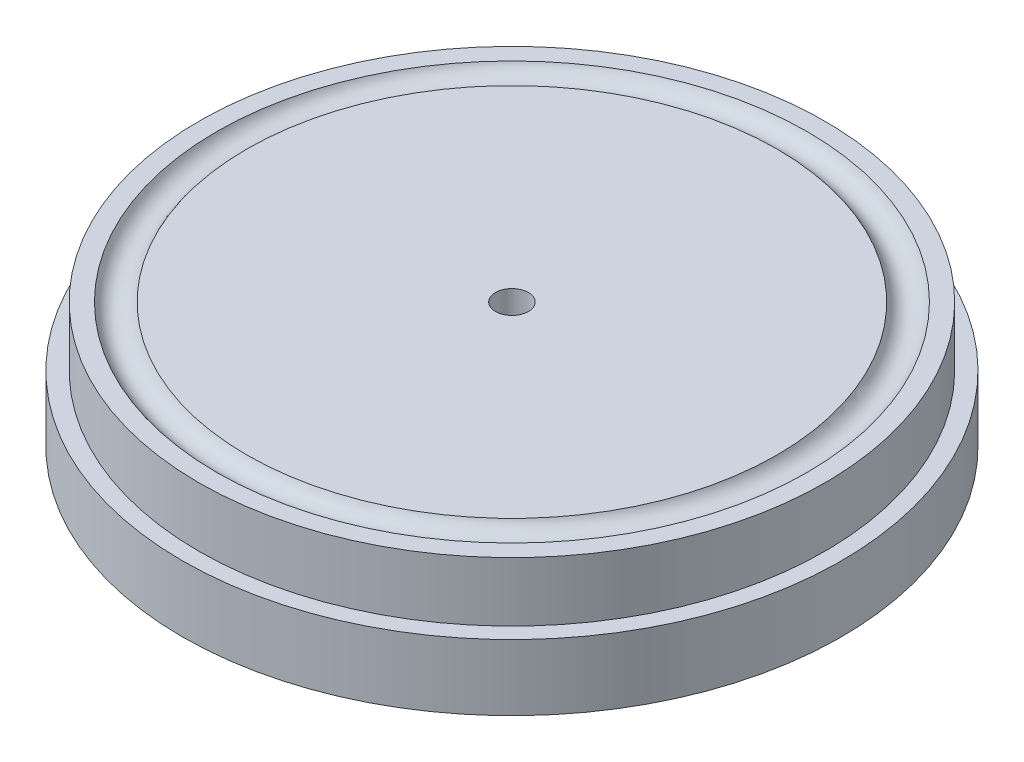
ISO-10303-21;
HEADER;
FILE_DESCRIPTION(('STEP AP214'),'2;1');
FILE_NAME('part.step','',(''),(''),'','','');
FILE_SCHEMA(('AUTOMOTIVE_DESIGN { 1 0 10303 214 1 1 1 1 }'));
ENDSEC;
DATA;
#1=APPLICATION_CONTEXT('core data for automotive mechanical design processes');
#2=APPLICATION_PROTOCOL_DEFINITION('international standard','automotive_design',2000,#1);
#3=PRODUCT_CONTEXT('',#1,'mechanical');
#4=PRODUCT('Part','Part','',(#3));
#5=PRODUCT_RELATED_PRODUCT_CATEGORY('part','',(#4));
#6=PRODUCT_DEFINITION_FORMATION('','',#4);
#7=PRODUCT_DEFINITION_CONTEXT('part definition',#1,'design');
#8=PRODUCT_DEFINITION('design','',#6,#7);
#9=PRODUCT_DEFINITION_SHAPE('','',#8);
#10=(LENGTH_UNIT() NAMED_UNIT(*) SI_UNIT(.MILLI.,.METRE.));
#11=(NAMED_UNIT(*) PLANE_ANGLE_UNIT() SI_UNIT($,.RADIAN.));
#12=(NAMED_UNIT(*) SI_UNIT($,.STERADIAN.) SOLID_ANGLE_UNIT());
#13=UNCERTAINTY_MEASURE_WITH_UNIT(LENGTH_MEASURE(1.E-05),#10,'distance_accuracy_value','');
#14=(GEOMETRIC_REPRESENTATION_CONTEXT(3) GLOBAL_UNCERTAINTY_ASSIGNED_CONTEXT((#13)) GLOBAL_UNIT_ASSIGNED_CONTEXT((#10,
#11,#12)) REPRESENTATION_CONTEXT('',''));
#15=CARTESIAN_POINT('',(0.,0.,0.));
#16=DIRECTION('',(0.,0.,1.));
#17=DIRECTION('',(1.,0.,0.));
#18=AXIS2_PLACEMENT_3D('',#15,#16,#17);
#19=CARTESIAN_POINT('',(0.,20.,0.));
#20=DIRECTION('',(0.,-1.,0.));
#21=DIRECTION('',(0.,0.,-1.));
#22=AXIS2_PLACEMENT_3D('',#19,#20,#21);
#23=CYLINDRICAL_SURFACE('',#22,47.5);
#24=CARTESIAN_POINT('',(0.,10.,0.));
#25=DIRECTION('',(0.,1.,0.));
#26=DIRECTION('',(0.,0.,1.));
#27=AXIS2_PLACEMENT_3D('',#24,#25,#26);
#28=CIRCLE('',#27,47.5);
#29=CARTESIAN_POINT('',(0.,10.,47.5));
#30=VERTEX_POINT('',#29);
#31=EDGE_CURVE('E11',#30,#30,#28,.T.);
#32=ORIENTED_EDGE('',*,*,#31,.T.);
#33=EDGE_LOOP('',(#32));
#34=FACE_BOUND('',#33,.T.);
#35=CARTESIAN_POINT('',(0.,19.,0.));
#36=DIRECTION('',(0.,1.,0.));
#37=DIRECTION('',(0.,0.,1.));
#38=AXIS2_PLACEMENT_3D('',#35,#36,#37);
#39=CIRCLE('',#38,47.5);
#40=CARTESIAN_POINT('',(0.,19.,47.5));
#41=VERTEX_POINT('',#40);
#42=EDGE_CURVE('E72',#41,#41,#39,.T.);
#43=ORIENTED_EDGE('',*,*,#42,.F.);
#44=EDGE_LOOP('',(#43));
#45=FACE_BOUND('',#44,.T.);
#46=ADVANCED_FACE('F43',(#34,#45),#23,.T.);
#47=CARTESIAN_POINT('',(0.,10.,0.));
#48=DIRECTION('',(0.,-1.,0.));
#49=DIRECTION('',(0.,0.,-1.));
#50=AXIS2_PLACEMENT_3D('',#47,#48,#49);
#51=CYLINDRICAL_SURFACE('',#50,50.);
#52=CARTESIAN_POINT('',(0.,10.,0.));
#53=DIRECTION('',(0.,1.,0.));
#54=DIRECTION('',(0.,0.,1.));
#55=AXIS2_PLACEMENT_3D('',#52,#53,#54);
#56=CIRCLE('',#55,50.);
#57=CARTESIAN_POINT('',(0.,10.,50.));
#58=VERTEX_POINT('',#57);
#59=EDGE_CURVE('E52',#58,#58,#56,.T.);
#60=ORIENTED_EDGE('',*,*,#59,.F.);
#61=EDGE_LOOP('',(#60));
#62=FACE_BOUND('',#61,.T.);
#63=CARTESIAN_POINT('',(0.,0.,0.));
#64=DIRECTION('',(0.,1.,0.));
#65=DIRECTION('',(0.,0.,1.));
#66=AXIS2_PLACEMENT_3D('',#63,#64,#65);
#67=CIRCLE('',#66,50.);
#68=CARTESIAN_POINT('',(0.,0.,50.));
#69=VERTEX_POINT('',#68);
#70=EDGE_CURVE('E78',#69,#69,#67,.T.);
#71=ORIENTED_EDGE('',*,*,#70,.T.);
#72=EDGE_LOOP('',(#71));
#73=FACE_BOUND('',#72,.T.);
#74=ADVANCED_FACE('F45',(#62,#73),#51,.T.);
#75=CARTESIAN_POINT('',(0.,10.,0.));
#76=DIRECTION('',(0.,1.,0.));
#77=DIRECTION('',(0.,0.,1.));
#78=AXIS2_PLACEMENT_3D('',#75,#76,#77);
#79=PLANE('',#78);
#80=ORIENTED_EDGE('',*,*,#31,.F.);
#81=EDGE_LOOP('',(#80));
#82=FACE_BOUND('',#81,.T.);
#83=ORIENTED_EDGE('',*,*,#59,.T.);
#84=EDGE_LOOP('',(#83));
#85=FACE_BOUND('',#84,.T.);
#86=ADVANCED_FACE('F88',(#82,#85),#79,.T.);
#87=CARTESIAN_POINT('',(0.,0.,0.));
#88=DIRECTION('',(0.,1.,0.));
#89=DIRECTION('',(0.,0.,1.));
#90=AXIS2_PLACEMENT_3D('',#87,#88,#89);
#91=PLANE('',#90);
#92=ORIENTED_EDGE('',*,*,#70,.F.);
#93=EDGE_LOOP('',(#92));
#94=FACE_BOUND('',#93,.T.);
#95=ADVANCED_FACE('F85',(#94),#91,.F.);
#96=CARTESIAN_POINT('',(0.,19.,0.));
#97=DIRECTION('',(0.,1.,0.));
#98=DIRECTION('',(0.,0.,1.));
#99=AXIS2_PLACEMENT_3D('',#96,#97,#98);
#100=PLANE('',#99);
#101=CARTESIAN_POINT('',(0.,19.,0.));
#102=DIRECTION('',(0.,1.,0.));
#103=DIRECTION('',(0.,0.,1.));
#104=AXIS2_PLACEMENT_3D('',#101,#102,#103);
#105=CIRCLE('',#104,44.7912878474779);
#106=CARTESIAN_POINT('',(44.7912878474779,19.,0.));
#107=VERTEX_POINT('',#106);
#108=EDGE_CURVE('E58',#107,#107,#105,.T.);
#109=ORIENTED_EDGE('',*,*,#108,.F.);
#110=EDGE_LOOP('',(#109));
#111=FACE_BOUND('',#110,.T.);
#112=ORIENTED_EDGE('',*,*,#42,.T.);
#113=EDGE_LOOP('',(#112));
#114=FACE_BOUND('',#113,.T.);
#115=ADVANCED_FACE('F87',(#111,#114),#100,.T.);
#116=CARTESIAN_POINT('',(0.,20.,0.));
#117=DIRECTION('',(0.,1.,0.));
#118=DIRECTION('',(0.,0.,1.));
#119=AXIS2_PLACEMENT_3D('',#116,#117,#118);
#120=TOROIDAL_SURFACE('',#119,42.5,2.5);
#121=CARTESIAN_POINT('',(42.5,20.,0.));
#122=DIRECTION('',(0.,0.,1.));
#123=DIRECTION('',(1.,0.,0.));
#124=AXIS2_PLACEMENT_3D('',#121,#122,#123);
#125=CIRCLE('',#124,2.5);
#126=CARTESIAN_POINT('',(40.2087121525221,19.,0.));
#127=VERTEX_POINT('',#126);
#128=EDGE_CURVE('E77',#127,#107,#125,.T.);
#129=ORIENTED_EDGE('',*,*,#128,.T.);
#130=ORIENTED_EDGE('',*,*,#108,.T.);
#131=ORIENTED_EDGE('',*,*,#128,.F.);
#132=CARTESIAN_POINT('',(0.,19.,0.));
#133=DIRECTION('',(0.,-1.,0.));
#134=DIRECTION('',(0.,0.,-1.));
#135=AXIS2_PLACEMENT_3D('',#132,#133,#134);
#136=CIRCLE('',#135,40.2087121525221);
#137=EDGE_CURVE('E62',#127,#127,#136,.T.);
#138=ORIENTED_EDGE('',*,*,#137,.T.);
#139=EDGE_LOOP('',(#129,#130,#131,#138));
#140=FACE_BOUND('',#139,.T.);
#141=ADVANCED_FACE('F94',(#140),#120,.F.);
#142=ORIENTED_EDGE('',*,*,#137,.F.);
#143=EDGE_LOOP('',(#142));
#144=FACE_BOUND('',#143,.T.);
#145=CARTESIAN_POINT('',(0.,19.,0.));
#146=DIRECTION('',(0.,1.,0.));
#147=DIRECTION('',(0.,0.,1.));
#148=AXIS2_PLACEMENT_3D('',#145,#146,#147);
#149=CIRCLE('',#148,2.5);
#150=CARTESIAN_POINT('',(0.,19.,2.5));
#151=VERTEX_POINT('',#150);
#152=EDGE_CURVE('E47',#151,#151,#149,.F.);
#153=ORIENTED_EDGE('',*,*,#152,.T.);
#154=EDGE_LOOP('',(#153));
#155=FACE_BOUND('',#154,.T.);
#156=ADVANCED_FACE('F63',(#144,#155),#100,.T.);
#157=CARTESIAN_POINT('',(0.,15.,0.));
#158=DIRECTION('',(0.,1.,0.));
#159=DIRECTION('',(0.,0.,1.));
#160=AXIS2_PLACEMENT_3D('',#157,#158,#159);
#161=PLANE('',#160);
#162=CARTESIAN_POINT('',(0.,15.,0.));
#163=DIRECTION('',(0.,1.,0.));
#164=DIRECTION('',(0.,0.,1.));
#165=AXIS2_PLACEMENT_3D('',#162,#163,#164);
#166=CIRCLE('',#165,2.5);
#167=CARTESIAN_POINT('',(0.,15.,2.5));
#168=VERTEX_POINT('',#167);
#169=EDGE_CURVE('E69',#168,#168,#166,.T.);
#170=ORIENTED_EDGE('',*,*,#169,.T.);
#171=EDGE_LOOP('',(#170));
#172=FACE_BOUND('',#171,.T.);
#173=ADVANCED_FACE('F112',(#172),#161,.T.);
#174=CARTESIAN_POINT('',(0.,15.,0.));
#175=DIRECTION('',(0.,1.,0.));
#176=DIRECTION('',(0.,0.,1.));
#177=AXIS2_PLACEMENT_3D('',#174,#175,#176);
#178=CYLINDRICAL_SURFACE('',#177,2.5);
#179=ORIENTED_EDGE('',*,*,#169,.F.);
#180=EDGE_LOOP('',(#179));
#181=FACE_BOUND('',#180,.T.);
#182=ORIENTED_EDGE('',*,*,#152,.F.);
#183=EDGE_LOOP('',(#182));
#184=FACE_BOUND('',#183,.T.);
#185=ADVANCED_FACE('F109',(#181,#184),#178,.F.);
#186=CLOSED_SHELL('',(#46,#74,#86,#95,#115,#141,#156,#173,#185));
#187=MANIFOLD_SOLID_BREP('B2',#186);
#188=ADVANCED_BREP_SHAPE_REPRESENTATION('',(#18,#187),#14);
#189=SHAPE_DEFINITION_REPRESENTATION(#9,#188);
ENDSEC;
END-ISO-10303-21;
